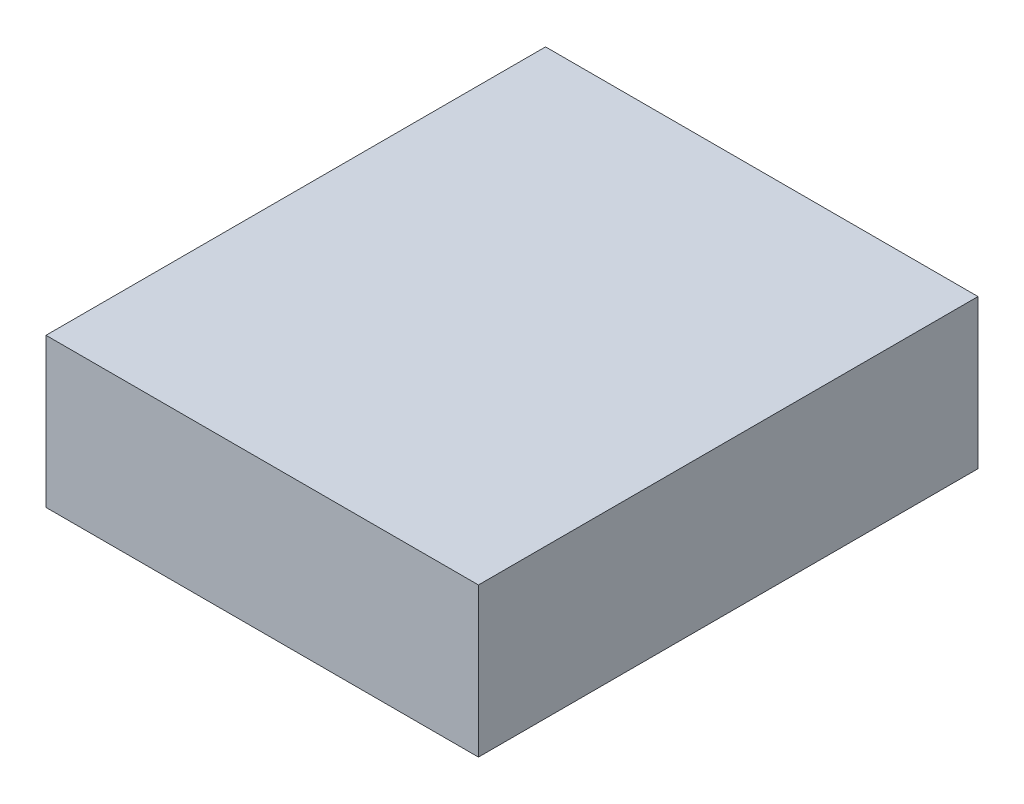
ISO-10303-21;
HEADER;
FILE_DESCRIPTION(('STEP AP214'),'2;1');
FILE_NAME('part.step','',(''),(''),'','','');
FILE_SCHEMA(('AUTOMOTIVE_DESIGN { 1 0 10303 214 1 1 1 1 }'));
ENDSEC;
DATA;
#1=APPLICATION_CONTEXT('core data for automotive mechanical design processes');
#2=APPLICATION_PROTOCOL_DEFINITION('international standard','automotive_design',2000,#1);
#3=PRODUCT_CONTEXT('',#1,'mechanical');
#4=PRODUCT('Part','Part','',(#3));
#5=PRODUCT_RELATED_PRODUCT_CATEGORY('part','',(#4));
#6=PRODUCT_DEFINITION_FORMATION('','',#4);
#7=PRODUCT_DEFINITION_CONTEXT('part definition',#1,'design');
#8=PRODUCT_DEFINITION('design','',#6,#7);
#9=PRODUCT_DEFINITION_SHAPE('','',#8);
#10=(LENGTH_UNIT() NAMED_UNIT(*) SI_UNIT(.MILLI.,.METRE.));
#11=(NAMED_UNIT(*) PLANE_ANGLE_UNIT() SI_UNIT($,.RADIAN.));
#12=(NAMED_UNIT(*) SI_UNIT($,.STERADIAN.) SOLID_ANGLE_UNIT());
#13=UNCERTAINTY_MEASURE_WITH_UNIT(LENGTH_MEASURE(1.E-05),#10,'distance_accuracy_value','');
#14=(GEOMETRIC_REPRESENTATION_CONTEXT(3) GLOBAL_UNCERTAINTY_ASSIGNED_CONTEXT((#13)) GLOBAL_UNIT_ASSIGNED_CONTEXT((#10,
#11,#12)) REPRESENTATION_CONTEXT('',''));
#15=CARTESIAN_POINT('',(0.,0.,0.));
#16=DIRECTION('',(0.,0.,1.));
#17=DIRECTION('',(1.,0.,0.));
#18=AXIS2_PLACEMENT_3D('',#15,#16,#17);
#19=CARTESIAN_POINT('',(-61.5729166666667,20.,-47.125));
#20=DIRECTION('',(-1.,0.,0.));
#21=DIRECTION('',(0.,0.,1.));
#22=AXIS2_PLACEMENT_3D('',#19,#20,#21);
#23=PLANE('',#22);
#24=DIRECTION('',(0.,0.,-1.));
#25=VECTOR('',#24,1.);
#26=CARTESIAN_POINT('',(-61.5729166666667,0.,-47.125));
#27=LINE('',#26,#25);
#28=CARTESIAN_POINT('',(-61.5729166666667,0.,19.875));
#29=VERTEX_POINT('',#28);
#30=CARTESIAN_POINT('',(-61.5729166666667,0.,-47.125));
#31=VERTEX_POINT('',#30);
#32=EDGE_CURVE('E96',#29,#31,#27,.T.);
#33=ORIENTED_EDGE('',*,*,#32,.T.);
#34=DIRECTION('',(0.,-1.,0.));
#35=VECTOR('',#34,1.);
#36=CARTESIAN_POINT('',(-61.5729166666667,20.,-47.125));
#37=LINE('',#36,#35);
#38=CARTESIAN_POINT('',(-61.5729166666667,20.,-47.125));
#39=VERTEX_POINT('',#38);
#40=EDGE_CURVE('E11',#39,#31,#37,.T.);
#41=ORIENTED_EDGE('',*,*,#40,.F.);
#42=DIRECTION('',(0.,0.,-1.));
#43=VECTOR('',#42,1.);
#44=CARTESIAN_POINT('',(-61.5729166666667,20.,-47.125));
#45=LINE('',#44,#43);
#46=CARTESIAN_POINT('',(-61.5729166666667,20.,19.875));
#47=VERTEX_POINT('',#46);
#48=EDGE_CURVE('E84',#47,#39,#45,.T.);
#49=ORIENTED_EDGE('',*,*,#48,.F.);
#50=DIRECTION('',(0.,-1.,0.));
#51=VECTOR('',#50,1.);
#52=CARTESIAN_POINT('',(-61.5729166666667,20.,19.875));
#53=LINE('',#52,#51);
#54=EDGE_CURVE('E92',#47,#29,#53,.T.);
#55=ORIENTED_EDGE('',*,*,#54,.T.);
#56=EDGE_LOOP('',(#33,#41,#49,#55));
#57=FACE_BOUND('',#56,.T.);
#58=ADVANCED_FACE('F33',(#57),#23,.F.);
#59=CARTESIAN_POINT('',(-119.572916666667,20.,-47.125));
#60=DIRECTION('',(0.,0.,1.));
#61=DIRECTION('',(1.,0.,0.));
#62=AXIS2_PLACEMENT_3D('',#59,#60,#61);
#63=PLANE('',#62);
#64=DIRECTION('',(-1.,0.,0.));
#65=VECTOR('',#64,1.);
#66=CARTESIAN_POINT('',(-119.572916666667,0.,-47.125));
#67=LINE('',#66,#65);
#68=CARTESIAN_POINT('',(-119.572916666667,0.,-47.125));
#69=VERTEX_POINT('',#68);
#70=EDGE_CURVE('E88',#31,#69,#67,.T.);
#71=ORIENTED_EDGE('',*,*,#70,.T.);
#72=DIRECTION('',(0.,-1.,0.));
#73=VECTOR('',#72,1.);
#74=CARTESIAN_POINT('',(-119.572916666667,20.,-47.125));
#75=LINE('',#74,#73);
#76=CARTESIAN_POINT('',(-119.572916666667,20.,-47.125));
#77=VERTEX_POINT('',#76);
#78=EDGE_CURVE('E41',#77,#69,#75,.T.);
#79=ORIENTED_EDGE('',*,*,#78,.F.);
#80=DIRECTION('',(-1.,0.,0.));
#81=VECTOR('',#80,1.);
#82=CARTESIAN_POINT('',(-119.572916666667,20.,-47.125));
#83=LINE('',#82,#81);
#84=EDGE_CURVE('E79',#39,#77,#83,.T.);
#85=ORIENTED_EDGE('',*,*,#84,.F.);
#86=ORIENTED_EDGE('',*,*,#40,.T.);
#87=EDGE_LOOP('',(#71,#79,#85,#86));
#88=FACE_BOUND('',#87,.T.);
#89=ADVANCED_FACE('F87',(#88),#63,.F.);
#90=CARTESIAN_POINT('',(-119.572916666667,20.,-47.125));
#91=DIRECTION('',(1.,0.,0.));
#92=DIRECTION('',(0.,0.,-1.));
#93=AXIS2_PLACEMENT_3D('',#90,#91,#92);
#94=PLANE('',#93);
#95=DIRECTION('',(0.,0.,1.));
#96=VECTOR('',#95,1.);
#97=CARTESIAN_POINT('',(-119.572916666667,0.,-47.125));
#98=LINE('',#97,#96);
#99=CARTESIAN_POINT('',(-119.572916666667,0.,19.875));
#100=VERTEX_POINT('',#99);
#101=EDGE_CURVE('E66',#69,#100,#98,.T.);
#102=ORIENTED_EDGE('',*,*,#101,.T.);
#103=DIRECTION('',(0.,-1.,0.));
#104=VECTOR('',#103,1.);
#105=CARTESIAN_POINT('',(-119.572916666667,20.,19.875));
#106=LINE('',#105,#104);
#107=CARTESIAN_POINT('',(-119.572916666667,20.,19.875));
#108=VERTEX_POINT('',#107);
#109=EDGE_CURVE('E89',#108,#100,#106,.T.);
#110=ORIENTED_EDGE('',*,*,#109,.F.);
#111=DIRECTION('',(0.,0.,1.));
#112=VECTOR('',#111,1.);
#113=CARTESIAN_POINT('',(-119.572916666667,20.,-47.125));
#114=LINE('',#113,#112);
#115=EDGE_CURVE('E82',#77,#108,#114,.T.);
#116=ORIENTED_EDGE('',*,*,#115,.F.);
#117=ORIENTED_EDGE('',*,*,#78,.T.);
#118=EDGE_LOOP('',(#102,#110,#116,#117));
#119=FACE_BOUND('',#118,.T.);
#120=ADVANCED_FACE('F90',(#119),#94,.F.);
#121=CARTESIAN_POINT('',(-119.572916666667,20.,19.875));
#122=DIRECTION('',(0.,0.,-1.));
#123=DIRECTION('',(-1.,0.,0.));
#124=AXIS2_PLACEMENT_3D('',#121,#122,#123);
#125=PLANE('',#124);
#126=DIRECTION('',(1.,0.,0.));
#127=VECTOR('',#126,1.);
#128=CARTESIAN_POINT('',(-119.572916666667,0.,19.875));
#129=LINE('',#128,#127);
#130=EDGE_CURVE('E72',#100,#29,#129,.T.);
#131=ORIENTED_EDGE('',*,*,#130,.T.);
#132=ORIENTED_EDGE('',*,*,#54,.F.);
#133=DIRECTION('',(1.,0.,0.));
#134=VECTOR('',#133,1.);
#135=CARTESIAN_POINT('',(-119.572916666667,20.,19.875));
#136=LINE('',#135,#134);
#137=EDGE_CURVE('E49',#108,#47,#136,.T.);
#138=ORIENTED_EDGE('',*,*,#137,.F.);
#139=ORIENTED_EDGE('',*,*,#109,.T.);
#140=EDGE_LOOP('',(#131,#132,#138,#139));
#141=FACE_BOUND('',#140,.T.);
#142=ADVANCED_FACE('F103',(#141),#125,.F.);
#143=CARTESIAN_POINT('',(0.,20.,0.));
#144=DIRECTION('',(0.,1.,0.));
#145=DIRECTION('',(0.,0.,1.));
#146=AXIS2_PLACEMENT_3D('',#143,#144,#145);
#147=PLANE('',#146);
#148=ORIENTED_EDGE('',*,*,#48,.T.);
#149=ORIENTED_EDGE('',*,*,#84,.T.);
#150=ORIENTED_EDGE('',*,*,#115,.T.);
#151=ORIENTED_EDGE('',*,*,#137,.T.);
#152=EDGE_LOOP('',(#148,#149,#150,#151));
#153=FACE_BOUND('',#152,.T.);
#154=ADVANCED_FACE('F80',(#153),#147,.T.);
#155=CARTESIAN_POINT('',(0.,0.,0.));
#156=DIRECTION('',(0.,1.,0.));
#157=DIRECTION('',(0.,0.,1.));
#158=AXIS2_PLACEMENT_3D('',#155,#156,#157);
#159=PLANE('',#158);
#160=ORIENTED_EDGE('',*,*,#32,.F.);
#161=ORIENTED_EDGE('',*,*,#130,.F.);
#162=ORIENTED_EDGE('',*,*,#101,.F.);
#163=ORIENTED_EDGE('',*,*,#70,.F.);
#164=EDGE_LOOP('',(#160,#161,#162,#163));
#165=FACE_BOUND('',#164,.T.);
#166=ADVANCED_FACE('F106',(#165),#159,.F.);
#167=CLOSED_SHELL('',(#58,#89,#120,#142,#154,#166));
#168=MANIFOLD_SOLID_BREP('B2',#167);
#169=ADVANCED_BREP_SHAPE_REPRESENTATION('',(#18,#168),#14);
#170=SHAPE_DEFINITION_REPRESENTATION(#9,#169);
ENDSEC;
END-ISO-10303-21;
